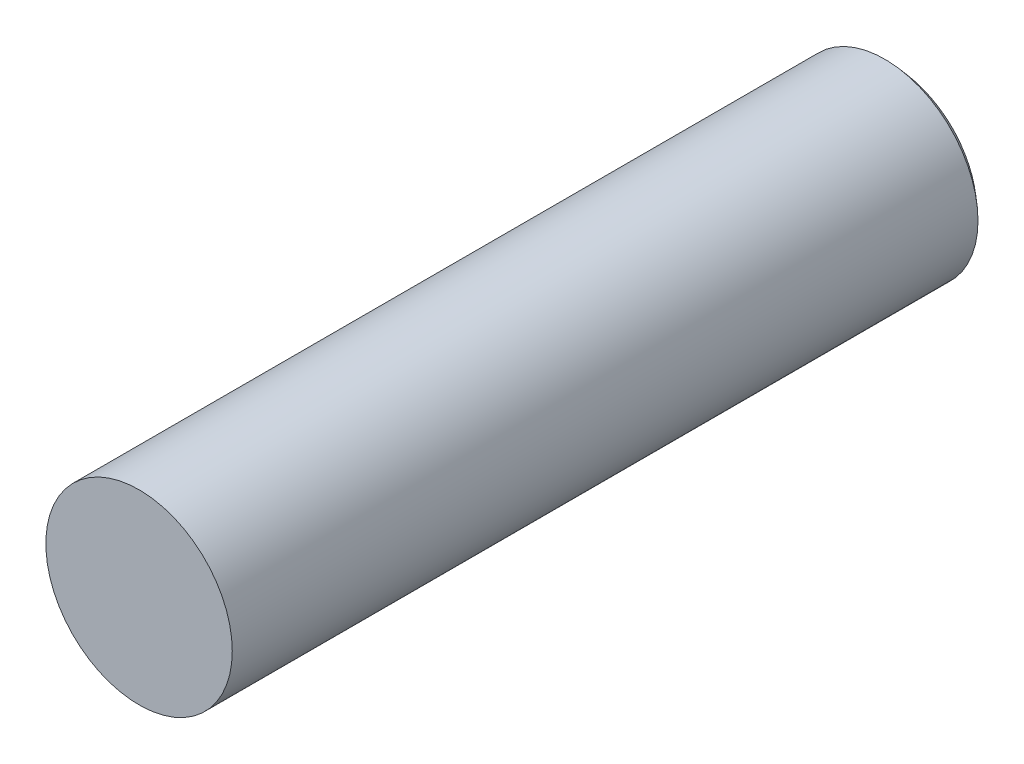
ISO-10303-21;
HEADER;
FILE_DESCRIPTION(('STEP AP214'),'2;1');
FILE_NAME('part.step','',(''),(''),'','','');
FILE_SCHEMA(('AUTOMOTIVE_DESIGN { 1 0 10303 214 1 1 1 1 }'));
ENDSEC;
DATA;
#1=APPLICATION_CONTEXT('core data for automotive mechanical design processes');
#2=APPLICATION_PROTOCOL_DEFINITION('international standard','automotive_design',2000,#1);
#3=PRODUCT_CONTEXT('',#1,'mechanical');
#4=PRODUCT('Part','Part','',(#3));
#5=PRODUCT_RELATED_PRODUCT_CATEGORY('part','',(#4));
#6=PRODUCT_DEFINITION_FORMATION('','',#4);
#7=PRODUCT_DEFINITION_CONTEXT('part definition',#1,'design');
#8=PRODUCT_DEFINITION('design','',#6,#7);
#9=PRODUCT_DEFINITION_SHAPE('','',#8);
#10=(LENGTH_UNIT() NAMED_UNIT(*) SI_UNIT(.MILLI.,.METRE.));
#11=(NAMED_UNIT(*) PLANE_ANGLE_UNIT() SI_UNIT($,.RADIAN.));
#12=(NAMED_UNIT(*) SI_UNIT($,.STERADIAN.) SOLID_ANGLE_UNIT());
#13=UNCERTAINTY_MEASURE_WITH_UNIT(LENGTH_MEASURE(1.E-05),#10,'distance_accuracy_value','');
#14=(GEOMETRIC_REPRESENTATION_CONTEXT(3) GLOBAL_UNCERTAINTY_ASSIGNED_CONTEXT((#13)) GLOBAL_UNIT_ASSIGNED_CONTEXT((#10,
#11,#12)) REPRESENTATION_CONTEXT('',''));
#15=CARTESIAN_POINT('',(0.,0.,0.));
#16=DIRECTION('',(0.,0.,1.));
#17=DIRECTION('',(1.,0.,0.));
#18=AXIS2_PLACEMENT_3D('',#15,#16,#17);
#19=CARTESIAN_POINT('',(0.,0.,2000.));
#20=DIRECTION('',(0.,0.,-1.));
#21=DIRECTION('',(-1.,0.,0.));
#22=AXIS2_PLACEMENT_3D('',#19,#20,#21);
#23=CYLINDRICAL_SURFACE('',#22,250.);
#24=CARTESIAN_POINT('',(0.,0.,2000.));
#25=DIRECTION('',(0.,0.,1.));
#26=DIRECTION('',(1.,0.,0.));
#27=AXIS2_PLACEMENT_3D('',#24,#25,#26);
#28=CIRCLE('',#27,250.);
#29=CARTESIAN_POINT('',(250.,0.,2000.));
#30=VERTEX_POINT('',#29);
#31=EDGE_CURVE('E10',#30,#30,#28,.T.);
#32=ORIENTED_EDGE('',*,*,#31,.F.);
#33=EDGE_LOOP('',(#32));
#34=FACE_BOUND('',#33,.T.);
#35=CARTESIAN_POINT('',(0.,0.,1.11022302462516E-13));
#36=DIRECTION('',(0.,0.,1.));
#37=DIRECTION('',(1.,0.,0.));
#38=AXIS2_PLACEMENT_3D('',#35,#36,#37);
#39=CIRCLE('',#38,250.);
#40=CARTESIAN_POINT('',(250.,0.,1.11022302462516E-13));
#41=VERTEX_POINT('',#40);
#42=EDGE_CURVE('E49',#41,#41,#39,.T.);
#43=ORIENTED_EDGE('',*,*,#42,.T.);
#44=EDGE_LOOP('',(#43));
#45=FACE_BOUND('',#44,.T.);
#46=ADVANCED_FACE('F43',(#34,#45),#23,.T.);
#47=CARTESIAN_POINT('',(0.,0.,2000.));
#48=DIRECTION('',(0.,0.,1.));
#49=DIRECTION('',(1.,0.,0.));
#50=AXIS2_PLACEMENT_3D('',#47,#48,#49);
#51=PLANE('',#50);
#52=ORIENTED_EDGE('',*,*,#31,.T.);
#53=EDGE_LOOP('',(#52));
#54=FACE_BOUND('',#53,.T.);
#55=ADVANCED_FACE('F58',(#54),#51,.T.);
#56=CARTESIAN_POINT('',(0.,0.,262.499999999999));
#57=DIRECTION('',(0.,0.,1.));
#58=DIRECTION('',(1.,0.,0.));
#59=AXIS2_PLACEMENT_3D('',#56,#57,#58);
#60=SPHERICAL_SURFACE('',#59,362.499999999999);
#61=ORIENTED_EDGE('',*,*,#42,.F.);
#62=EDGE_LOOP('',(#61));
#63=FACE_BOUND('',#62,.T.);
#64=ADVANCED_FACE('F56',(#63),#60,.T.);
#65=CLOSED_SHELL('',(#46,#55,#64));
#66=MANIFOLD_SOLID_BREP('B2',#65);
#67=ADVANCED_BREP_SHAPE_REPRESENTATION('',(#18,#66),#14);
#68=SHAPE_DEFINITION_REPRESENTATION(#9,#67);
ENDSEC;
END-ISO-10303-21;
